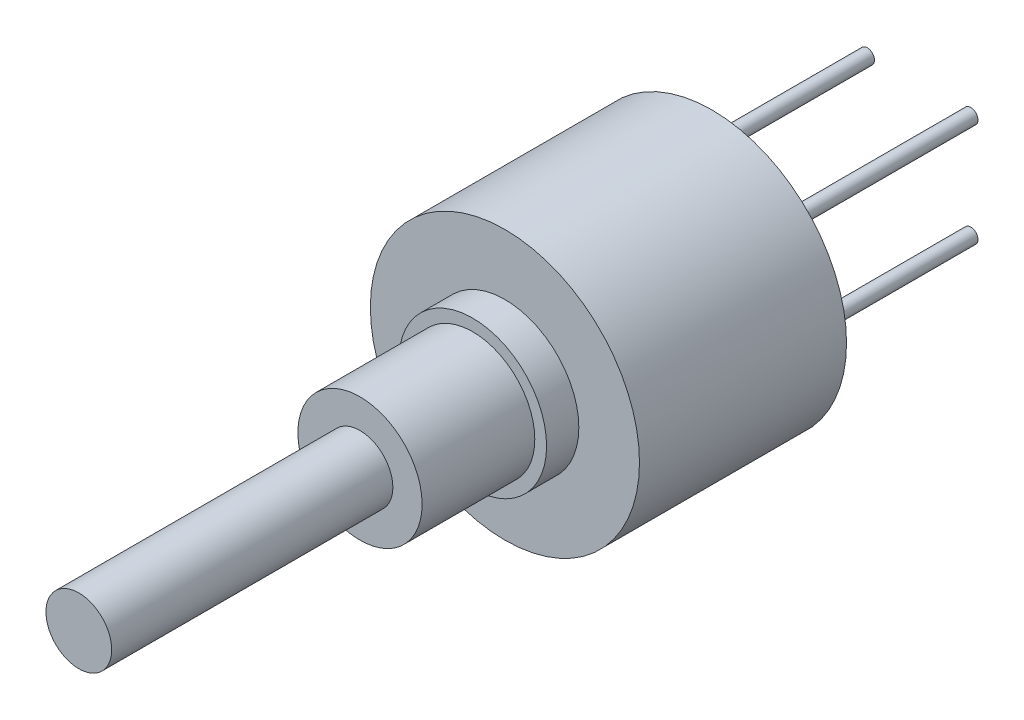
ISO-10303-21;
HEADER;
FILE_DESCRIPTION(('STEP AP214'),'2;1');
FILE_NAME('part.step','',(''),(''),'','','');
FILE_SCHEMA(('AUTOMOTIVE_DESIGN { 1 0 10303 214 1 1 1 1 }'));
ENDSEC;
DATA;
#1=APPLICATION_CONTEXT('core data for automotive mechanical design processes');
#2=APPLICATION_PROTOCOL_DEFINITION('international standard','automotive_design',2000,#1);
#3=PRODUCT_CONTEXT('',#1,'mechanical');
#4=PRODUCT('Part','Part','',(#3));
#5=PRODUCT_RELATED_PRODUCT_CATEGORY('part','',(#4));
#6=PRODUCT_DEFINITION_FORMATION('','',#4);
#7=PRODUCT_DEFINITION_CONTEXT('part definition',#1,'design');
#8=PRODUCT_DEFINITION('design','',#6,#7);
#9=PRODUCT_DEFINITION_SHAPE('','',#8);
#10=(LENGTH_UNIT() NAMED_UNIT(*) SI_UNIT(.MILLI.,.METRE.));
#11=(NAMED_UNIT(*) PLANE_ANGLE_UNIT() SI_UNIT($,.RADIAN.));
#12=(NAMED_UNIT(*) SI_UNIT($,.STERADIAN.) SOLID_ANGLE_UNIT());
#13=UNCERTAINTY_MEASURE_WITH_UNIT(LENGTH_MEASURE(1.E-05),#10,'distance_accuracy_value','');
#14=(GEOMETRIC_REPRESENTATION_CONTEXT(3) GLOBAL_UNCERTAINTY_ASSIGNED_CONTEXT((#13)) GLOBAL_UNIT_ASSIGNED_CONTEXT((#10,
#11,#12)) REPRESENTATION_CONTEXT('',''));
#15=CARTESIAN_POINT('',(0.,0.,0.));
#16=DIRECTION('',(0.,0.,1.));
#17=DIRECTION('',(1.,0.,0.));
#18=AXIS2_PLACEMENT_3D('',#15,#16,#17);
#19=CARTESIAN_POINT('',(0.,-14.4414213562373,0.));
#20=DIRECTION('',(0.,0.,1.));
#21=DIRECTION('',(1.,0.,0.));
#22=AXIS2_PLACEMENT_3D('',#19,#20,#21);
#23=PLANE('',#22);
#24=CARTESIAN_POINT('',(-2.5,-2.5,0.));
#25=DIRECTION('',(0.,0.,1.));
#26=DIRECTION('',(1.,0.,0.));
#27=AXIS2_PLACEMENT_3D('',#24,#25,#26);
#28=CIRCLE('',#27,0.35);
#29=CARTESIAN_POINT('',(-2.15,-2.5,0.));
#30=VERTEX_POINT('',#29);
#31=EDGE_CURVE('E39',#30,#30,#28,.F.);
#32=ORIENTED_EDGE('',*,*,#31,.F.);
#33=EDGE_LOOP('',(#32));
#34=FACE_BOUND('',#33,.T.);
#35=CARTESIAN_POINT('',(2.5,2.5,0.));
#36=DIRECTION('',(0.,0.,1.));
#37=DIRECTION('',(1.,0.,0.));
#38=AXIS2_PLACEMENT_3D('',#35,#36,#37);
#39=CIRCLE('',#38,0.35);
#40=CARTESIAN_POINT('',(2.85,2.5,0.));
#41=VERTEX_POINT('',#40);
#42=EDGE_CURVE('E47',#41,#41,#39,.F.);
#43=ORIENTED_EDGE('',*,*,#42,.F.);
#44=EDGE_LOOP('',(#43));
#45=FACE_BOUND('',#44,.T.);
#46=CARTESIAN_POINT('',(0.,0.,0.));
#47=DIRECTION('',(0.,0.,1.));
#48=DIRECTION('',(1.,0.,0.));
#49=AXIS2_PLACEMENT_3D('',#46,#47,#48);
#50=CIRCLE('',#49,6.5);
#51=CARTESIAN_POINT('',(6.5,0.,0.));
#52=VERTEX_POINT('',#51);
#53=EDGE_CURVE('E62',#52,#52,#50,.T.);
#54=ORIENTED_EDGE('',*,*,#53,.F.);
#55=EDGE_LOOP('',(#54));
#56=FACE_BOUND('',#55,.T.);
#57=CARTESIAN_POINT('',(-2.5,2.5,0.));
#58=DIRECTION('',(0.,0.,1.));
#59=DIRECTION('',(1.,0.,0.));
#60=AXIS2_PLACEMENT_3D('',#57,#58,#59);
#61=CIRCLE('',#60,0.35);
#62=CARTESIAN_POINT('',(-2.15,2.5,0.));
#63=VERTEX_POINT('',#62);
#64=EDGE_CURVE('E43',#63,#63,#61,.F.);
#65=ORIENTED_EDGE('',*,*,#64,.F.);
#66=EDGE_LOOP('',(#65));
#67=FACE_BOUND('',#66,.T.);
#68=CARTESIAN_POINT('',(2.5,-2.5,0.));
#69=DIRECTION('',(0.,0.,1.));
#70=DIRECTION('',(1.,0.,0.));
#71=AXIS2_PLACEMENT_3D('',#68,#69,#70);
#72=CIRCLE('',#71,0.35);
#73=CARTESIAN_POINT('',(2.85,-2.5,0.));
#74=VERTEX_POINT('',#73);
#75=EDGE_CURVE('E10',#74,#74,#72,.F.);
#76=ORIENTED_EDGE('',*,*,#75,.F.);
#77=EDGE_LOOP('',(#76));
#78=FACE_BOUND('',#77,.T.);
#79=ADVANCED_FACE('F32',(#34,#45,#56,#67,#78),#23,.F.);
#80=CARTESIAN_POINT('',(0.,-14.4414213562373,17.));
#81=DIRECTION('',(0.,0.,1.));
#82=DIRECTION('',(1.,0.,0.));
#83=AXIS2_PLACEMENT_3D('',#80,#81,#82);
#84=PLANE('',#83);
#85=CARTESIAN_POINT('',(0.,0.,17.));
#86=DIRECTION('',(0.,0.,1.));
#87=DIRECTION('',(1.,0.,0.));
#88=AXIS2_PLACEMENT_3D('',#85,#86,#87);
#89=CIRCLE('',#88,3.);
#90=CARTESIAN_POINT('',(3.,0.,17.));
#91=VERTEX_POINT('',#90);
#92=EDGE_CURVE('E56',#91,#91,#89,.T.);
#93=ORIENTED_EDGE('',*,*,#92,.T.);
#94=EDGE_LOOP('',(#93));
#95=FACE_BOUND('',#94,.T.);
#96=CARTESIAN_POINT('',(0.,0.,17.));
#97=DIRECTION('',(0.,0.,1.));
#98=DIRECTION('',(1.,0.,0.));
#99=AXIS2_PLACEMENT_3D('',#96,#97,#98);
#100=CIRCLE('',#99,1.5875);
#101=CARTESIAN_POINT('',(1.5875,0.,17.));
#102=VERTEX_POINT('',#101);
#103=EDGE_CURVE('E53',#102,#102,#100,.F.);
#104=ORIENTED_EDGE('',*,*,#103,.T.);
#105=EDGE_LOOP('',(#104));
#106=FACE_BOUND('',#105,.T.);
#107=ADVANCED_FACE('F104',(#95,#106),#84,.T.);
#108=CARTESIAN_POINT('',(0.,-14.4414213562373,11.557));
#109=DIRECTION('',(0.,0.,1.));
#110=DIRECTION('',(1.,0.,0.));
#111=AXIS2_PLACEMENT_3D('',#108,#109,#110);
#112=PLANE('',#111);
#113=CARTESIAN_POINT('',(0.,0.,11.557));
#114=DIRECTION('',(0.,0.,1.));
#115=DIRECTION('',(1.,0.,0.));
#116=AXIS2_PLACEMENT_3D('',#113,#114,#115);
#117=CIRCLE('',#116,3.57);
#118=CARTESIAN_POINT('',(3.57,0.,11.557));
#119=VERTEX_POINT('',#118);
#120=EDGE_CURVE('E61',#119,#119,#117,.T.);
#121=ORIENTED_EDGE('',*,*,#120,.T.);
#122=EDGE_LOOP('',(#121));
#123=FACE_BOUND('',#122,.T.);
#124=CARTESIAN_POINT('',(0.,0.,11.557));
#125=DIRECTION('',(0.,0.,1.));
#126=DIRECTION('',(1.,0.,0.));
#127=AXIS2_PLACEMENT_3D('',#124,#125,#126);
#128=CIRCLE('',#127,3.);
#129=CARTESIAN_POINT('',(3.,0.,11.557));
#130=VERTEX_POINT('',#129);
#131=EDGE_CURVE('E58',#130,#130,#128,.F.);
#132=ORIENTED_EDGE('',*,*,#131,.T.);
#133=EDGE_LOOP('',(#132));
#134=FACE_BOUND('',#133,.T.);
#135=ADVANCED_FACE('F109',(#123,#134),#112,.T.);
#136=CARTESIAN_POINT('',(0.,-14.4414213562373,10.));
#137=DIRECTION('',(0.,0.,1.));
#138=DIRECTION('',(1.,0.,0.));
#139=AXIS2_PLACEMENT_3D('',#136,#137,#138);
#140=PLANE('',#139);
#141=CARTESIAN_POINT('',(0.,0.,10.));
#142=DIRECTION('',(0.,0.,1.));
#143=DIRECTION('',(1.,0.,0.));
#144=AXIS2_PLACEMENT_3D('',#141,#142,#143);
#145=CIRCLE('',#144,6.5);
#146=CARTESIAN_POINT('',(6.5,0.,10.));
#147=VERTEX_POINT('',#146);
#148=EDGE_CURVE('E52',#147,#147,#145,.T.);
#149=ORIENTED_EDGE('',*,*,#148,.T.);
#150=EDGE_LOOP('',(#149));
#151=FACE_BOUND('',#150,.T.);
#152=CARTESIAN_POINT('',(0.,0.,10.));
#153=DIRECTION('',(0.,0.,1.));
#154=DIRECTION('',(1.,0.,0.));
#155=AXIS2_PLACEMENT_3D('',#152,#153,#154);
#156=CIRCLE('',#155,3.57);
#157=CARTESIAN_POINT('',(3.57,0.,10.));
#158=VERTEX_POINT('',#157);
#159=EDGE_CURVE('E65',#158,#158,#156,.F.);
#160=ORIENTED_EDGE('',*,*,#159,.T.);
#161=EDGE_LOOP('',(#160));
#162=FACE_BOUND('',#161,.T.);
#163=ADVANCED_FACE('F114',(#151,#162),#140,.T.);
#164=CARTESIAN_POINT('',(0.,0.,10.));
#165=DIRECTION('',(0.,0.,-1.));
#166=DIRECTION('',(-1.,0.,0.));
#167=AXIS2_PLACEMENT_3D('',#164,#165,#166);
#168=CYLINDRICAL_SURFACE('',#167,6.5);
#169=ORIENTED_EDGE('',*,*,#148,.F.);
#170=EDGE_LOOP('',(#169));
#171=FACE_BOUND('',#170,.T.);
#172=ORIENTED_EDGE('',*,*,#53,.T.);
#173=EDGE_LOOP('',(#172));
#174=FACE_BOUND('',#173,.T.);
#175=ADVANCED_FACE('F34',(#171,#174),#168,.T.);
#176=CARTESIAN_POINT('',(0.,0.,11.557));
#177=DIRECTION('',(0.,0.,-1.));
#178=DIRECTION('',(-1.,0.,0.));
#179=AXIS2_PLACEMENT_3D('',#176,#177,#178);
#180=CYLINDRICAL_SURFACE('',#179,3.57);
#181=ORIENTED_EDGE('',*,*,#159,.F.);
#182=EDGE_LOOP('',(#181));
#183=FACE_BOUND('',#182,.T.);
#184=ORIENTED_EDGE('',*,*,#120,.F.);
#185=EDGE_LOOP('',(#184));
#186=FACE_BOUND('',#185,.T.);
#187=ADVANCED_FACE('F118',(#183,#186),#180,.T.);
#188=CARTESIAN_POINT('',(0.,0.,17.));
#189=DIRECTION('',(0.,0.,-1.));
#190=DIRECTION('',(-1.,0.,0.));
#191=AXIS2_PLACEMENT_3D('',#188,#189,#190);
#192=CYLINDRICAL_SURFACE('',#191,3.);
#193=ORIENTED_EDGE('',*,*,#131,.F.);
#194=EDGE_LOOP('',(#193));
#195=FACE_BOUND('',#194,.T.);
#196=ORIENTED_EDGE('',*,*,#92,.F.);
#197=EDGE_LOOP('',(#196));
#198=FACE_BOUND('',#197,.T.);
#199=ADVANCED_FACE('F121',(#195,#198),#192,.T.);
#200=CARTESIAN_POINT('',(0.,0.,30.5816));
#201=DIRECTION('',(0.,0.,-1.));
#202=DIRECTION('',(-1.,0.,0.));
#203=AXIS2_PLACEMENT_3D('',#200,#201,#202);
#204=CYLINDRICAL_SURFACE('',#203,1.5875);
#205=ORIENTED_EDGE('',*,*,#103,.F.);
#206=EDGE_LOOP('',(#205));
#207=FACE_BOUND('',#206,.T.);
#208=CARTESIAN_POINT('',(0.,0.,30.5816));
#209=DIRECTION('',(0.,0.,1.));
#210=DIRECTION('',(1.,0.,0.));
#211=AXIS2_PLACEMENT_3D('',#208,#209,#210);
#212=CIRCLE('',#211,1.5875);
#213=CARTESIAN_POINT('',(1.5875,0.,30.5816));
#214=VERTEX_POINT('',#213);
#215=EDGE_CURVE('E57',#214,#214,#212,.T.);
#216=ORIENTED_EDGE('',*,*,#215,.F.);
#217=EDGE_LOOP('',(#216));
#218=FACE_BOUND('',#217,.T.);
#219=ADVANCED_FACE('F127',(#207,#218),#204,.T.);
#220=CARTESIAN_POINT('',(0.,-14.4414213562373,30.5816));
#221=DIRECTION('',(0.,0.,1.));
#222=DIRECTION('',(1.,0.,0.));
#223=AXIS2_PLACEMENT_3D('',#220,#221,#222);
#224=PLANE('',#223);
#225=ORIENTED_EDGE('',*,*,#215,.T.);
#226=EDGE_LOOP('',(#225));
#227=FACE_BOUND('',#226,.T.);
#228=ADVANCED_FACE('F132',(#227),#224,.T.);
#229=CARTESIAN_POINT('',(2.5,2.5,-10.));
#230=DIRECTION('',(0.,0.,1.));
#231=DIRECTION('',(1.,0.,0.));
#232=AXIS2_PLACEMENT_3D('',#229,#230,#231);
#233=CYLINDRICAL_SURFACE('',#232,0.35);
#234=CARTESIAN_POINT('',(2.5,2.5,-10.));
#235=DIRECTION('',(0.,0.,-1.));
#236=DIRECTION('',(-1.,0.,0.));
#237=AXIS2_PLACEMENT_3D('',#234,#235,#236);
#238=CIRCLE('',#237,0.35);
#239=CARTESIAN_POINT('',(2.15,2.5,-10.));
#240=VERTEX_POINT('',#239);
#241=EDGE_CURVE('E76',#240,#240,#238,.T.);
#242=ORIENTED_EDGE('',*,*,#241,.F.);
#243=EDGE_LOOP('',(#242));
#244=FACE_BOUND('',#243,.T.);
#245=ORIENTED_EDGE('',*,*,#42,.T.);
#246=EDGE_LOOP('',(#245));
#247=FACE_BOUND('',#246,.T.);
#248=ADVANCED_FACE('F136',(#244,#247),#233,.T.);
#249=CARTESIAN_POINT('',(2.5,2.5,-10.));
#250=DIRECTION('',(0.,0.,-1.));
#251=DIRECTION('',(-1.,0.,0.));
#252=AXIS2_PLACEMENT_3D('',#249,#250,#251);
#253=PLANE('',#252);
#254=ORIENTED_EDGE('',*,*,#241,.T.);
#255=EDGE_LOOP('',(#254));
#256=FACE_BOUND('',#255,.T.);
#257=ADVANCED_FACE('F140',(#256),#253,.T.);
#258=CARTESIAN_POINT('',(-2.5,2.5,-10.));
#259=DIRECTION('',(0.,0.,1.));
#260=DIRECTION('',(1.,0.,0.));
#261=AXIS2_PLACEMENT_3D('',#258,#259,#260);
#262=CYLINDRICAL_SURFACE('',#261,0.35);
#263=CARTESIAN_POINT('',(-2.5,2.5,-10.));
#264=DIRECTION('',(0.,0.,-1.));
#265=DIRECTION('',(-1.,0.,0.));
#266=AXIS2_PLACEMENT_3D('',#263,#264,#265);
#267=CIRCLE('',#266,0.35);
#268=CARTESIAN_POINT('',(-2.85,2.5,-10.));
#269=VERTEX_POINT('',#268);
#270=EDGE_CURVE('E79',#269,#269,#267,.T.);
#271=ORIENTED_EDGE('',*,*,#270,.F.);
#272=EDGE_LOOP('',(#271));
#273=FACE_BOUND('',#272,.T.);
#274=ORIENTED_EDGE('',*,*,#64,.T.);
#275=EDGE_LOOP('',(#274));
#276=FACE_BOUND('',#275,.T.);
#277=ADVANCED_FACE('F144',(#273,#276),#262,.T.);
#278=CARTESIAN_POINT('',(-2.5,2.5,-10.));
#279=DIRECTION('',(0.,0.,-1.));
#280=DIRECTION('',(-1.,0.,0.));
#281=AXIS2_PLACEMENT_3D('',#278,#279,#280);
#282=PLANE('',#281);
#283=ORIENTED_EDGE('',*,*,#270,.T.);
#284=EDGE_LOOP('',(#283));
#285=FACE_BOUND('',#284,.T.);
#286=ADVANCED_FACE('F148',(#285),#282,.T.);
#287=CARTESIAN_POINT('',(-2.5,-2.5,-10.));
#288=DIRECTION('',(0.,0.,1.));
#289=DIRECTION('',(1.,0.,0.));
#290=AXIS2_PLACEMENT_3D('',#287,#288,#289);
#291=CYLINDRICAL_SURFACE('',#290,0.35);
#292=CARTESIAN_POINT('',(-2.5,-2.5,-10.));
#293=DIRECTION('',(0.,0.,-1.));
#294=DIRECTION('',(-1.,0.,0.));
#295=AXIS2_PLACEMENT_3D('',#292,#293,#294);
#296=CIRCLE('',#295,0.35);
#297=CARTESIAN_POINT('',(-2.85,-2.5,-10.));
#298=VERTEX_POINT('',#297);
#299=EDGE_CURVE('E82',#298,#298,#296,.T.);
#300=ORIENTED_EDGE('',*,*,#299,.F.);
#301=EDGE_LOOP('',(#300));
#302=FACE_BOUND('',#301,.T.);
#303=ORIENTED_EDGE('',*,*,#31,.T.);
#304=EDGE_LOOP('',(#303));
#305=FACE_BOUND('',#304,.T.);
#306=ADVANCED_FACE('F100',(#302,#305),#291,.T.);
#307=CARTESIAN_POINT('',(-2.5,-2.5,-10.));
#308=DIRECTION('',(0.,0.,-1.));
#309=DIRECTION('',(-1.,0.,0.));
#310=AXIS2_PLACEMENT_3D('',#307,#308,#309);
#311=PLANE('',#310);
#312=ORIENTED_EDGE('',*,*,#299,.T.);
#313=EDGE_LOOP('',(#312));
#314=FACE_BOUND('',#313,.T.);
#315=ADVANCED_FACE('F93',(#314),#311,.T.);
#316=CARTESIAN_POINT('',(2.5,-2.5,-10.));
#317=DIRECTION('',(0.,0.,1.));
#318=DIRECTION('',(1.,0.,0.));
#319=AXIS2_PLACEMENT_3D('',#316,#317,#318);
#320=CYLINDRICAL_SURFACE('',#319,0.35);
#321=CARTESIAN_POINT('',(2.5,-2.5,-10.));
#322=DIRECTION('',(0.,0.,-1.));
#323=DIRECTION('',(-1.,0.,0.));
#324=AXIS2_PLACEMENT_3D('',#321,#322,#323);
#325=CIRCLE('',#324,0.35);
#326=CARTESIAN_POINT('',(2.15,-2.5,-10.));
#327=VERTEX_POINT('',#326);
#328=EDGE_CURVE('E85',#327,#327,#325,.T.);
#329=ORIENTED_EDGE('',*,*,#328,.F.);
#330=EDGE_LOOP('',(#329));
#331=FACE_BOUND('',#330,.T.);
#332=ORIENTED_EDGE('',*,*,#75,.T.);
#333=EDGE_LOOP('',(#332));
#334=FACE_BOUND('',#333,.T.);
#335=ADVANCED_FACE('F91',(#331,#334),#320,.T.);
#336=CARTESIAN_POINT('',(2.5,-2.5,-10.));
#337=DIRECTION('',(0.,0.,-1.));
#338=DIRECTION('',(-1.,0.,0.));
#339=AXIS2_PLACEMENT_3D('',#336,#337,#338);
#340=PLANE('',#339);
#341=ORIENTED_EDGE('',*,*,#328,.T.);
#342=EDGE_LOOP('',(#341));
#343=FACE_BOUND('',#342,.T.);
#344=ADVANCED_FACE('F89',(#343),#340,.T.);
#345=CLOSED_SHELL('',(#79,#107,#135,#163,#175,#187,#199,#219,#228,#248,#257,#277,#286,#306,#315,
#335,#344));
#346=MANIFOLD_SOLID_BREP('B2',#345);
#347=ADVANCED_BREP_SHAPE_REPRESENTATION('',(#18,#346),#14);
#348=SHAPE_DEFINITION_REPRESENTATION(#9,#347);
ENDSEC;
END-ISO-10303-21;
